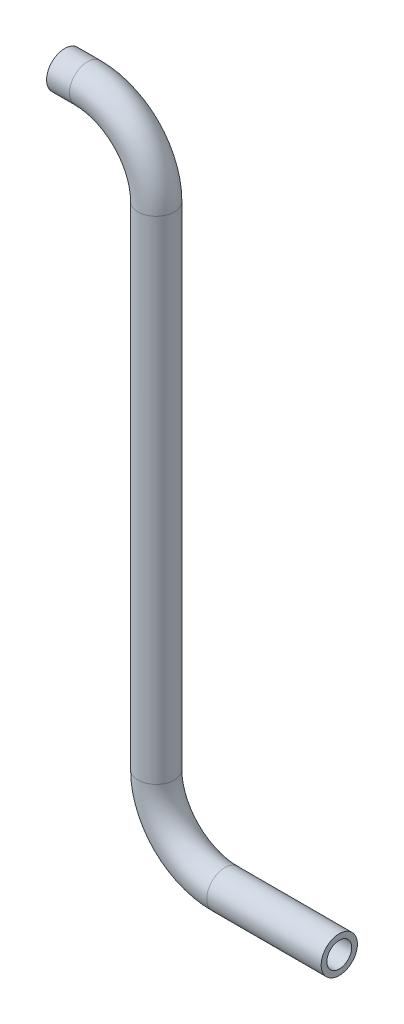
ISO-10303-21;
HEADER;
FILE_DESCRIPTION(('STEP AP214'),'2;1');
FILE_NAME('part.step','',(''),(''),'','','');
FILE_SCHEMA(('AUTOMOTIVE_DESIGN { 1 0 10303 214 1 1 1 1 }'));
ENDSEC;
DATA;
#1=APPLICATION_CONTEXT('core data for automotive mechanical design processes');
#2=APPLICATION_PROTOCOL_DEFINITION('international standard','automotive_design',2000,#1);
#3=PRODUCT_CONTEXT('',#1,'mechanical');
#4=PRODUCT('Part','Part','',(#3));
#5=PRODUCT_RELATED_PRODUCT_CATEGORY('part','',(#4));
#6=PRODUCT_DEFINITION_FORMATION('','',#4);
#7=PRODUCT_DEFINITION_CONTEXT('part definition',#1,'design');
#8=PRODUCT_DEFINITION('design','',#6,#7);
#9=PRODUCT_DEFINITION_SHAPE('','',#8);
#10=(LENGTH_UNIT() NAMED_UNIT(*) SI_UNIT(.MILLI.,.METRE.));
#11=(NAMED_UNIT(*) PLANE_ANGLE_UNIT() SI_UNIT($,.RADIAN.));
#12=(NAMED_UNIT(*) SI_UNIT($,.STERADIAN.) SOLID_ANGLE_UNIT());
#13=UNCERTAINTY_MEASURE_WITH_UNIT(LENGTH_MEASURE(1.E-05),#10,'distance_accuracy_value','');
#14=(GEOMETRIC_REPRESENTATION_CONTEXT(3) GLOBAL_UNCERTAINTY_ASSIGNED_CONTEXT((#13)) GLOBAL_UNIT_ASSIGNED_CONTEXT((#10,
#11,#12)) REPRESENTATION_CONTEXT('',''));
#15=CARTESIAN_POINT('',(0.,0.,0.));
#16=DIRECTION('',(0.,0.,1.));
#17=DIRECTION('',(1.,0.,0.));
#18=AXIS2_PLACEMENT_3D('',#15,#16,#17);
#19=CARTESIAN_POINT('',(15.9999999999996,-1.59594559789866E-13,0.));
#20=DIRECTION('',(1.,0.,0.));
#21=DIRECTION('',(0.,0.,-1.));
#22=AXIS2_PLACEMENT_3D('',#19,#20,#21);
#23=PLANE('',#22);
#24=CARTESIAN_POINT('',(15.9999999999996,-1.59594559789866E-13,0.));
#25=DIRECTION('',(1.,0.,0.));
#26=DIRECTION('',(0.,0.,-1.));
#27=AXIS2_PLACEMENT_3D('',#24,#25,#26);
#28=CIRCLE('',#27,1.085);
#29=CARTESIAN_POINT('',(15.9999999999996,-1.59594559789866E-13,-1.085));
#30=VERTEX_POINT('',#29);
#31=EDGE_CURVE('E74',#30,#30,#28,.T.);
#32=ORIENTED_EDGE('',*,*,#31,.F.);
#33=EDGE_LOOP('',(#32));
#34=FACE_BOUND('',#33,.T.);
#35=CARTESIAN_POINT('',(15.9999999999996,-1.59594559789866E-13,0.));
#36=DIRECTION('',(1.,0.,0.));
#37=DIRECTION('',(0.,0.,-1.));
#38=AXIS2_PLACEMENT_3D('',#35,#36,#37);
#39=CIRCLE('',#38,1.585);
#40=CARTESIAN_POINT('',(15.9999999999996,-1.59594559789866E-13,-1.585));
#41=VERTEX_POINT('',#40);
#42=EDGE_CURVE('E67',#41,#41,#39,.T.);
#43=ORIENTED_EDGE('',*,*,#42,.T.);
#44=EDGE_LOOP('',(#43));
#45=FACE_BOUND('',#44,.T.);
#46=ADVANCED_FACE('F45',(#34,#45),#23,.T.);
#47=CARTESIAN_POINT('',(-8.00000000000038,55.,0.));
#48=DIRECTION('',(1.,0.,0.));
#49=DIRECTION('',(0.,0.,-1.));
#50=AXIS2_PLACEMENT_3D('',#47,#48,#49);
#51=PLANE('',#50);
#52=CARTESIAN_POINT('',(-8.00000000000038,55.,0.));
#53=DIRECTION('',(1.,0.,0.));
#54=DIRECTION('',(0.,0.,-1.));
#55=AXIS2_PLACEMENT_3D('',#52,#53,#54);
#56=CIRCLE('',#55,1.085);
#57=CARTESIAN_POINT('',(-8.00000000000038,55.,-1.085));
#58=VERTEX_POINT('',#57);
#59=EDGE_CURVE('E70',#58,#58,#56,.T.);
#60=ORIENTED_EDGE('',*,*,#59,.T.);
#61=EDGE_LOOP('',(#60));
#62=FACE_BOUND('',#61,.T.);
#63=CARTESIAN_POINT('',(-8.00000000000038,55.,0.));
#64=DIRECTION('',(1.,0.,0.));
#65=DIRECTION('',(0.,0.,-1.));
#66=AXIS2_PLACEMENT_3D('',#63,#64,#65);
#67=CIRCLE('',#66,1.585);
#68=CARTESIAN_POINT('',(-8.00000000000038,55.,-1.585));
#69=VERTEX_POINT('',#68);
#70=EDGE_CURVE('E11',#69,#69,#67,.T.);
#71=ORIENTED_EDGE('',*,*,#70,.F.);
#72=EDGE_LOOP('',(#71));
#73=FACE_BOUND('',#72,.T.);
#74=ADVANCED_FACE('F100',(#62,#73),#51,.F.);
#75=CARTESIAN_POINT('',(15.9999999999996,-1.59594559789866E-13,0.));
#76=DIRECTION('',(-1.,0.,0.));
#77=DIRECTION('',(0.,-1.,0.));
#78=AXIS2_PLACEMENT_3D('',#75,#76,#77);
#79=CYLINDRICAL_SURFACE('',#78,1.585);
#80=CARTESIAN_POINT('',(5.99999999999962,0.,0.));
#81=DIRECTION('',(1.,0.,0.));
#82=DIRECTION('',(0.,0.,-1.));
#83=AXIS2_PLACEMENT_3D('',#80,#81,#82);
#84=CIRCLE('',#83,1.585);
#85=CARTESIAN_POINT('',(5.99999999999951,-1.5850000000001,0.));
#86=VERTEX_POINT('',#85);
#87=EDGE_CURVE('E64',#86,#86,#84,.T.);
#88=ORIENTED_EDGE('',*,*,#87,.T.);
#89=EDGE_LOOP('',(#88));
#90=FACE_BOUND('',#89,.T.);
#91=ORIENTED_EDGE('',*,*,#42,.F.);
#92=EDGE_LOOP('',(#91));
#93=FACE_BOUND('',#92,.T.);
#94=ADVANCED_FACE('F104',(#90,#93),#79,.T.);
#95=CARTESIAN_POINT('',(6.00000000000002,5.99999999999996,0.));
#96=DIRECTION('',(0.,0.,-1.));
#97=DIRECTION('',(-1.,0.,0.));
#98=AXIS2_PLACEMENT_3D('',#95,#96,#97);
#99=TOROIDAL_SURFACE('',#98,6.00000000000006,1.585);
#100=CARTESIAN_POINT('',(0.,5.99999999999998,0.));
#101=DIRECTION('',(0.,-1.,0.));
#102=DIRECTION('',(0.,0.,-1.));
#103=AXIS2_PLACEMENT_3D('',#100,#101,#102);
#104=CIRCLE('',#103,1.585);
#105=CARTESIAN_POINT('',(-1.58500000000004,5.99999999999998,0.));
#106=VERTEX_POINT('',#105);
#107=EDGE_CURVE('E59',#106,#106,#104,.T.);
#108=CARTESIAN_POINT('',(6.00000000000002,5.99999999999996,0.));
#109=DIRECTION('',(0.,0.,-1.));
#110=DIRECTION('',(-1.,0.,0.));
#111=AXIS2_PLACEMENT_3D('',#108,#109,#110);
#112=CIRCLE('',#111,7.58500000000006);
#113=EDGE_CURVE('',#86,#106,#112,.T.);
#114=ORIENTED_EDGE('',*,*,#87,.F.);
#115=ORIENTED_EDGE('',*,*,#107,.T.);
#116=ORIENTED_EDGE('',*,*,#113,.T.);
#117=ORIENTED_EDGE('',*,*,#113,.F.);
#118=EDGE_LOOP('',(#114,#116,#115,#117));
#119=FACE_BOUND('',#118,.T.);
#120=ADVANCED_FACE('F106',(#119),#99,.T.);
#121=CARTESIAN_POINT('',(0.,5.99999999999998,0.));
#122=DIRECTION('',(0.,1.,0.));
#123=DIRECTION('',(-1.,0.,0.));
#124=AXIS2_PLACEMENT_3D('',#121,#122,#123);
#125=CYLINDRICAL_SURFACE('',#124,1.585);
#126=CARTESIAN_POINT('',(1.52655665885959E-13,49.,0.));
#127=DIRECTION('',(0.,-1.,0.));
#128=DIRECTION('',(0.,0.,-1.));
#129=AXIS2_PLACEMENT_3D('',#126,#127,#128);
#130=CIRCLE('',#129,1.585);
#131=CARTESIAN_POINT('',(1.58500000000016,49.,0.));
#132=VERTEX_POINT('',#131);
#133=EDGE_CURVE('E55',#132,#132,#130,.T.);
#134=ORIENTED_EDGE('',*,*,#133,.T.);
#135=EDGE_LOOP('',(#134));
#136=FACE_BOUND('',#135,.T.);
#137=ORIENTED_EDGE('',*,*,#107,.F.);
#138=EDGE_LOOP('',(#137));
#139=FACE_BOUND('',#138,.T.);
#140=ADVANCED_FACE('F113',(#136,#139),#125,.T.);
#141=CARTESIAN_POINT('',(-5.99999999999984,49.,0.));
#142=DIRECTION('',(0.,0.,1.));
#143=DIRECTION('',(1.,0.,0.));
#144=AXIS2_PLACEMENT_3D('',#141,#142,#143);
#145=TOROIDAL_SURFACE('',#144,5.99999999999999,1.585);
#146=CARTESIAN_POINT('',(-5.99999999999975,55.,0.));
#147=DIRECTION('',(1.,0.,0.));
#148=DIRECTION('',(0.,0.,-1.));
#149=AXIS2_PLACEMENT_3D('',#146,#147,#148);
#150=CIRCLE('',#149,1.585);
#151=CARTESIAN_POINT('',(-5.99999999999973,56.585,0.));
#152=VERTEX_POINT('',#151);
#153=EDGE_CURVE('E51',#152,#152,#150,.T.);
#154=CARTESIAN_POINT('',(-5.99999999999984,49.,0.));
#155=DIRECTION('',(0.,0.,1.));
#156=DIRECTION('',(1.,0.,0.));
#157=AXIS2_PLACEMENT_3D('',#154,#155,#156);
#158=CIRCLE('',#157,7.58499999999999);
#159=EDGE_CURVE('',#132,#152,#158,.T.);
#160=ORIENTED_EDGE('',*,*,#133,.F.);
#161=ORIENTED_EDGE('',*,*,#153,.T.);
#162=ORIENTED_EDGE('',*,*,#159,.T.);
#163=ORIENTED_EDGE('',*,*,#159,.F.);
#164=EDGE_LOOP('',(#160,#162,#161,#163));
#165=FACE_BOUND('',#164,.T.);
#166=ADVANCED_FACE('F119',(#165),#145,.T.);
#167=CARTESIAN_POINT('',(-5.99999999999985,55.,0.));
#168=DIRECTION('',(-1.,0.,0.));
#169=DIRECTION('',(0.,0.,1.));
#170=AXIS2_PLACEMENT_3D('',#167,#168,#169);
#171=CYLINDRICAL_SURFACE('',#170,1.585);
#172=ORIENTED_EDGE('',*,*,#70,.T.);
#173=EDGE_LOOP('',(#172));
#174=FACE_BOUND('',#173,.T.);
#175=ORIENTED_EDGE('',*,*,#153,.F.);
#176=EDGE_LOOP('',(#175));
#177=FACE_BOUND('',#176,.T.);
#178=ADVANCED_FACE('F94',(#174,#177),#171,.T.);
#179=CARTESIAN_POINT('',(15.9999999999996,-1.59594559789866E-13,0.));
#180=DIRECTION('',(-1.,0.,0.));
#181=DIRECTION('',(0.,-1.,0.));
#182=AXIS2_PLACEMENT_3D('',#179,#180,#181);
#183=CYLINDRICAL_SURFACE('',#182,1.085);
#184=CARTESIAN_POINT('',(5.99999999999962,0.,0.));
#185=DIRECTION('',(-1.,0.,0.));
#186=DIRECTION('',(0.,-1.,0.));
#187=AXIS2_PLACEMENT_3D('',#184,#185,#186);
#188=CIRCLE('',#187,1.085);
#189=CARTESIAN_POINT('',(5.99999999999954,-1.0850000000001,0.));
#190=VERTEX_POINT('',#189);
#191=EDGE_CURVE('E77',#190,#190,#188,.F.);
#192=ORIENTED_EDGE('',*,*,#191,.F.);
#193=EDGE_LOOP('',(#192));
#194=FACE_BOUND('',#193,.T.);
#195=ORIENTED_EDGE('',*,*,#31,.T.);
#196=EDGE_LOOP('',(#195));
#197=FACE_BOUND('',#196,.T.);
#198=ADVANCED_FACE('F91',(#194,#197),#183,.F.);
#199=CARTESIAN_POINT('',(6.00000000000002,5.99999999999996,0.));
#200=DIRECTION('',(0.,0.,-1.));
#201=DIRECTION('',(-1.,0.,0.));
#202=AXIS2_PLACEMENT_3D('',#199,#200,#201);
#203=TOROIDAL_SURFACE('',#202,6.00000000000006,1.085);
#204=CARTESIAN_POINT('',(0.,5.99999999999998,0.));
#205=DIRECTION('',(0.,-1.,0.));
#206=DIRECTION('',(1.,0.,0.));
#207=AXIS2_PLACEMENT_3D('',#204,#205,#206);
#208=CIRCLE('',#207,1.085);
#209=CARTESIAN_POINT('',(-1.08500000000004,5.99999999999998,0.));
#210=VERTEX_POINT('',#209);
#211=EDGE_CURVE('E83',#210,#210,#208,.T.);
#212=CARTESIAN_POINT('',(6.00000000000002,5.99999999999996,0.));
#213=DIRECTION('',(0.,0.,-1.));
#214=DIRECTION('',(-1.,0.,0.));
#215=AXIS2_PLACEMENT_3D('',#212,#213,#214);
#216=CIRCLE('',#215,7.08500000000006);
#217=EDGE_CURVE('',#190,#210,#216,.T.);
#218=ORIENTED_EDGE('',*,*,#191,.T.);
#219=ORIENTED_EDGE('',*,*,#211,.F.);
#220=ORIENTED_EDGE('',*,*,#217,.T.);
#221=ORIENTED_EDGE('',*,*,#217,.F.);
#222=EDGE_LOOP('',(#218,#220,#219,#221));
#223=FACE_BOUND('',#222,.T.);
#224=ADVANCED_FACE('F89',(#223),#203,.F.);
#225=CARTESIAN_POINT('',(0.,5.99999999999998,0.));
#226=DIRECTION('',(0.,1.,0.));
#227=DIRECTION('',(-1.,0.,0.));
#228=AXIS2_PLACEMENT_3D('',#225,#226,#227);
#229=CYLINDRICAL_SURFACE('',#228,1.085);
#230=CARTESIAN_POINT('',(1.56125112837913E-13,49.,0.));
#231=DIRECTION('',(0.,1.,0.));
#232=DIRECTION('',(-1.,0.,0.));
#233=AXIS2_PLACEMENT_3D('',#230,#231,#232);
#234=CIRCLE('',#233,1.085);
#235=CARTESIAN_POINT('',(1.08500000000016,49.,0.));
#236=VERTEX_POINT('',#235);
#237=EDGE_CURVE('E80',#236,#236,#234,.F.);
#238=ORIENTED_EDGE('',*,*,#237,.F.);
#239=EDGE_LOOP('',(#238));
#240=FACE_BOUND('',#239,.T.);
#241=ORIENTED_EDGE('',*,*,#211,.T.);
#242=EDGE_LOOP('',(#241));
#243=FACE_BOUND('',#242,.T.);
#244=ADVANCED_FACE('F162',(#240,#243),#229,.F.);
#245=CARTESIAN_POINT('',(-5.99999999999984,49.,0.));
#246=DIRECTION('',(0.,0.,1.));
#247=DIRECTION('',(1.,0.,0.));
#248=AXIS2_PLACEMENT_3D('',#245,#246,#247);
#249=TOROIDAL_SURFACE('',#248,5.99999999999999,1.085);
#250=CARTESIAN_POINT('',(-5.99999999999975,55.,0.));
#251=DIRECTION('',(1.,0.,0.));
#252=DIRECTION('',(0.,1.,0.));
#253=AXIS2_PLACEMENT_3D('',#250,#251,#252);
#254=CIRCLE('',#253,1.085);
#255=CARTESIAN_POINT('',(-5.99999999999973,56.085,0.));
#256=VERTEX_POINT('',#255);
#257=EDGE_CURVE('E73',#256,#256,#254,.T.);
#258=CARTESIAN_POINT('',(-5.99999999999984,49.,0.));
#259=DIRECTION('',(0.,0.,1.));
#260=DIRECTION('',(1.,0.,0.));
#261=AXIS2_PLACEMENT_3D('',#258,#259,#260);
#262=CIRCLE('',#261,7.08499999999999);
#263=EDGE_CURVE('',#236,#256,#262,.T.);
#264=ORIENTED_EDGE('',*,*,#237,.T.);
#265=ORIENTED_EDGE('',*,*,#257,.F.);
#266=ORIENTED_EDGE('',*,*,#263,.T.);
#267=ORIENTED_EDGE('',*,*,#263,.F.);
#268=EDGE_LOOP('',(#264,#266,#265,#267));
#269=FACE_BOUND('',#268,.T.);
#270=ADVANCED_FACE('F172',(#269),#249,.F.);
#271=CARTESIAN_POINT('',(-5.99999999999985,55.,0.));
#272=DIRECTION('',(-1.,0.,0.));
#273=DIRECTION('',(0.,0.,1.));
#274=AXIS2_PLACEMENT_3D('',#271,#272,#273);
#275=CYLINDRICAL_SURFACE('',#274,1.085);
#276=ORIENTED_EDGE('',*,*,#59,.F.);
#277=EDGE_LOOP('',(#276));
#278=FACE_BOUND('',#277,.T.);
#279=ORIENTED_EDGE('',*,*,#257,.T.);
#280=EDGE_LOOP('',(#279));
#281=FACE_BOUND('',#280,.T.);
#282=ADVANCED_FACE('F101',(#278,#281),#275,.F.);
#283=CLOSED_SHELL('',(#46,#74,#94,#120,#140,#166,#178,#198,#224,#244,#270,#282));
#284=MANIFOLD_SOLID_BREP('B2',#283);
#285=ADVANCED_BREP_SHAPE_REPRESENTATION('',(#18,#284),#14);
#286=SHAPE_DEFINITION_REPRESENTATION(#9,#285);
ENDSEC;
END-ISO-10303-21;
